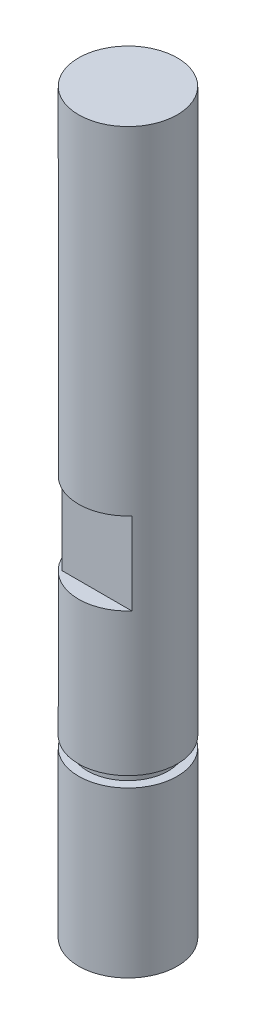
ISO-10303-21;
HEADER;
FILE_DESCRIPTION(('STEP AP214'),'2;1');
FILE_NAME('part.step','',(''),(''),'','','');
FILE_SCHEMA(('AUTOMOTIVE_DESIGN { 1 0 10303 214 1 1 1 1 }'));
ENDSEC;
DATA;
#1=APPLICATION_CONTEXT('core data for automotive mechanical design processes');
#2=APPLICATION_PROTOCOL_DEFINITION('international standard','automotive_design',2000,#1);
#3=PRODUCT_CONTEXT('',#1,'mechanical');
#4=PRODUCT('Part','Part','',(#3));
#5=PRODUCT_RELATED_PRODUCT_CATEGORY('part','',(#4));
#6=PRODUCT_DEFINITION_FORMATION('','',#4);
#7=PRODUCT_DEFINITION_CONTEXT('part definition',#1,'design');
#8=PRODUCT_DEFINITION('design','',#6,#7);
#9=PRODUCT_DEFINITION_SHAPE('','',#8);
#10=(LENGTH_UNIT() NAMED_UNIT(*) SI_UNIT(.MILLI.,.METRE.));
#11=(NAMED_UNIT(*) PLANE_ANGLE_UNIT() SI_UNIT($,.RADIAN.));
#12=(NAMED_UNIT(*) SI_UNIT($,.STERADIAN.) SOLID_ANGLE_UNIT());
#13=UNCERTAINTY_MEASURE_WITH_UNIT(LENGTH_MEASURE(1.E-05),#10,'distance_accuracy_value','');
#14=(GEOMETRIC_REPRESENTATION_CONTEXT(3) GLOBAL_UNCERTAINTY_ASSIGNED_CONTEXT((#13)) GLOBAL_UNIT_ASSIGNED_CONTEXT((#10,
#11,#12)) REPRESENTATION_CONTEXT('',''));
#15=CARTESIAN_POINT('',(0.,0.,0.));
#16=DIRECTION('',(0.,0.,1.));
#17=DIRECTION('',(1.,0.,0.));
#18=AXIS2_PLACEMENT_3D('',#15,#16,#17);
#19=CARTESIAN_POINT('',(0.,19.32,0.));
#20=DIRECTION('',(0.,1.,0.));
#21=DIRECTION('',(0.,0.,1.));
#22=AXIS2_PLACEMENT_3D('',#19,#20,#21);
#23=PLANE('',#22);
#24=CARTESIAN_POINT('',(0.,19.32,0.));
#25=DIRECTION('',(0.,1.,0.));
#26=DIRECTION('',(0.,0.,1.));
#27=AXIS2_PLACEMENT_3D('',#24,#25,#26);
#28=CIRCLE('',#27,3.);
#29=CARTESIAN_POINT('',(-2.,19.32,-2.23606797749979));
#30=VERTEX_POINT('',#29);
#31=CARTESIAN_POINT('',(2.23606797749979,19.32,2.));
#32=VERTEX_POINT('',#31);
#33=EDGE_CURVE('E59',#30,#32,#28,.T.);
#34=ORIENTED_EDGE('',*,*,#33,.T.);
#35=DIRECTION('',(-1.,0.,0.));
#36=VECTOR('',#35,1.);
#37=CARTESIAN_POINT('',(0.,19.32,2.));
#38=LINE('',#37,#36);
#39=CARTESIAN_POINT('',(-2.,19.32,2.));
#40=VERTEX_POINT('',#39);
#41=EDGE_CURVE('E94',#32,#40,#38,.T.);
#42=ORIENTED_EDGE('',*,*,#41,.T.);
#43=DIRECTION('',(0.,0.,1.));
#44=VECTOR('',#43,1.);
#45=CARTESIAN_POINT('',(-2.,19.32,0.));
#46=LINE('',#45,#44);
#47=EDGE_CURVE('E56',#30,#40,#46,.T.);
#48=ORIENTED_EDGE('',*,*,#47,.F.);
#49=EDGE_LOOP('',(#34,#42,#48));
#50=FACE_BOUND('',#49,.T.);
#51=ADVANCED_FACE('F38',(#50),#23,.T.);
#52=CARTESIAN_POINT('',(0.,10.,0.));
#53=DIRECTION('',(0.,1.,0.));
#54=DIRECTION('',(0.,0.,1.));
#55=AXIS2_PLACEMENT_3D('',#52,#53,#54);
#56=PLANE('',#55);
#57=CARTESIAN_POINT('',(0.,10.,0.));
#58=DIRECTION('',(0.,1.,0.));
#59=DIRECTION('',(0.,0.,1.));
#60=AXIS2_PLACEMENT_3D('',#57,#58,#59);
#61=CIRCLE('',#60,3.);
#62=CARTESIAN_POINT('',(0.,10.,3.));
#63=VERTEX_POINT('',#62);
#64=EDGE_CURVE('E11',#63,#63,#61,.T.);
#65=ORIENTED_EDGE('',*,*,#64,.T.);
#66=EDGE_LOOP('',(#65));
#67=FACE_BOUND('',#66,.T.);
#68=CARTESIAN_POINT('',(0.,10.,0.));
#69=DIRECTION('',(0.,1.,0.));
#70=DIRECTION('',(0.,0.,1.));
#71=AXIS2_PLACEMENT_3D('',#68,#69,#70);
#72=CIRCLE('',#71,2.45);
#73=CARTESIAN_POINT('',(0.,10.,2.45));
#74=VERTEX_POINT('',#73);
#75=EDGE_CURVE('E114',#74,#74,#72,.T.);
#76=ORIENTED_EDGE('',*,*,#75,.F.);
#77=EDGE_LOOP('',(#76));
#78=FACE_BOUND('',#77,.T.);
#79=ADVANCED_FACE('F137',(#67,#78),#56,.T.);
#80=CARTESIAN_POINT('',(0.,10.,0.));
#81=DIRECTION('',(0.,-1.,0.));
#82=DIRECTION('',(0.,0.,-1.));
#83=AXIS2_PLACEMENT_3D('',#80,#81,#82);
#84=CYLINDRICAL_SURFACE('',#83,3.);
#85=ORIENTED_EDGE('',*,*,#64,.F.);
#86=EDGE_LOOP('',(#85));
#87=FACE_BOUND('',#86,.T.);
#88=CARTESIAN_POINT('',(0.,0.,0.));
#89=DIRECTION('',(0.,1.,0.));
#90=DIRECTION('',(0.,0.,1.));
#91=AXIS2_PLACEMENT_3D('',#88,#89,#90);
#92=CIRCLE('',#91,3.);
#93=CARTESIAN_POINT('',(0.,0.,3.));
#94=VERTEX_POINT('',#93);
#95=EDGE_CURVE('E48',#94,#94,#92,.T.);
#96=ORIENTED_EDGE('',*,*,#95,.T.);
#97=EDGE_LOOP('',(#96));
#98=FACE_BOUND('',#97,.T.);
#99=ADVANCED_FACE('F40',(#87,#98),#84,.T.);
#100=CARTESIAN_POINT('',(0.,0.,0.));
#101=DIRECTION('',(0.,1.,0.));
#102=DIRECTION('',(0.,0.,1.));
#103=AXIS2_PLACEMENT_3D('',#100,#101,#102);
#104=PLANE('',#103);
#105=ORIENTED_EDGE('',*,*,#95,.F.);
#106=EDGE_LOOP('',(#105));
#107=FACE_BOUND('',#106,.T.);
#108=ADVANCED_FACE('F149',(#107),#104,.F.);
#109=CARTESIAN_POINT('',(0.,10.65,0.));
#110=DIRECTION('',(0.,-1.,0.));
#111=DIRECTION('',(0.,0.,-1.));
#112=AXIS2_PLACEMENT_3D('',#109,#110,#111);
#113=CYLINDRICAL_SURFACE('',#112,2.45);
#114=CARTESIAN_POINT('',(0.,10.65,0.));
#115=DIRECTION('',(0.,1.,0.));
#116=DIRECTION('',(0.,0.,1.));
#117=AXIS2_PLACEMENT_3D('',#114,#115,#116);
#118=CIRCLE('',#117,2.45);
#119=CARTESIAN_POINT('',(0.,10.65,2.45));
#120=VERTEX_POINT('',#119);
#121=EDGE_CURVE('E111',#120,#120,#118,.T.);
#122=ORIENTED_EDGE('',*,*,#121,.F.);
#123=EDGE_LOOP('',(#122));
#124=FACE_BOUND('',#123,.T.);
#125=ORIENTED_EDGE('',*,*,#75,.T.);
#126=EDGE_LOOP('',(#125));
#127=FACE_BOUND('',#126,.T.);
#128=ADVANCED_FACE('F145',(#124,#127),#113,.T.);
#129=CARTESIAN_POINT('',(0.,10.65,0.));
#130=DIRECTION('',(0.,1.,0.));
#131=DIRECTION('',(0.,0.,1.));
#132=AXIS2_PLACEMENT_3D('',#129,#130,#131);
#133=PLANE('',#132);
#134=CARTESIAN_POINT('',(0.,10.65,0.));
#135=DIRECTION('',(0.,1.,0.));
#136=DIRECTION('',(0.,0.,1.));
#137=AXIS2_PLACEMENT_3D('',#134,#135,#136);
#138=CIRCLE('',#137,3.);
#139=CARTESIAN_POINT('',(0.,10.65,3.));
#140=VERTEX_POINT('',#139);
#141=EDGE_CURVE('E108',#140,#140,#138,.T.);
#142=ORIENTED_EDGE('',*,*,#141,.F.);
#143=EDGE_LOOP('',(#142));
#144=FACE_BOUND('',#143,.T.);
#145=ORIENTED_EDGE('',*,*,#121,.T.);
#146=EDGE_LOOP('',(#145));
#147=FACE_BOUND('',#146,.T.);
#148=ADVANCED_FACE('F133',(#144,#147),#133,.F.);
#149=CARTESIAN_POINT('',(0.,19.32,0.));
#150=DIRECTION('',(0.,-1.,0.));
#151=DIRECTION('',(0.,0.,-1.));
#152=AXIS2_PLACEMENT_3D('',#149,#150,#151);
#153=CYLINDRICAL_SURFACE('',#152,3.);
#154=ORIENTED_EDGE('',*,*,#33,.F.);
#155=DIRECTION('',(0.,-1.,0.));
#156=VECTOR('',#155,1.);
#157=CARTESIAN_POINT('',(-2.,24.32,-2.23606797749979));
#158=LINE('',#157,#156);
#159=CARTESIAN_POINT('',(-2.,24.32,-2.23606797749979));
#160=VERTEX_POINT('',#159);
#161=EDGE_CURVE('E90',#160,#30,#158,.T.);
#162=ORIENTED_EDGE('',*,*,#161,.F.);
#163=CARTESIAN_POINT('',(0.,24.32,0.));
#164=DIRECTION('',(0.,1.,0.));
#165=DIRECTION('',(0.,0.,1.));
#166=AXIS2_PLACEMENT_3D('',#163,#164,#165);
#167=CIRCLE('',#166,3.);
#168=CARTESIAN_POINT('',(2.23606797749979,24.32,2.));
#169=VERTEX_POINT('',#168);
#170=EDGE_CURVE('E76',#160,#169,#167,.T.);
#171=ORIENTED_EDGE('',*,*,#170,.T.);
#172=DIRECTION('',(0.,-1.,0.));
#173=VECTOR('',#172,1.);
#174=CARTESIAN_POINT('',(2.23606797749979,24.32,2.));
#175=LINE('',#174,#173);
#176=EDGE_CURVE('E82',#169,#32,#175,.T.);
#177=ORIENTED_EDGE('',*,*,#176,.T.);
#178=EDGE_LOOP('',(#154,#162,#171,#177));
#179=FACE_BOUND('',#178,.T.);
#180=ORIENTED_EDGE('',*,*,#141,.T.);
#181=EDGE_LOOP('',(#180));
#182=FACE_BOUND('',#181,.T.);
#183=CARTESIAN_POINT('',(0.,44.82,0.));
#184=DIRECTION('',(0.,1.,0.));
#185=DIRECTION('',(0.,0.,1.));
#186=AXIS2_PLACEMENT_3D('',#183,#184,#185);
#187=CIRCLE('',#186,3.);
#188=CARTESIAN_POINT('',(0.,44.82,3.));
#189=VERTEX_POINT('',#188);
#190=EDGE_CURVE('E91',#189,#189,#187,.T.);
#191=ORIENTED_EDGE('',*,*,#190,.F.);
#192=EDGE_LOOP('',(#191));
#193=FACE_BOUND('',#192,.T.);
#194=ADVANCED_FACE('F86',(#179,#182,#193),#153,.T.);
#195=CARTESIAN_POINT('',(-2.,24.32,0.));
#196=DIRECTION('',(1.,0.,0.));
#197=DIRECTION('',(0.,0.,-1.));
#198=AXIS2_PLACEMENT_3D('',#195,#196,#197);
#199=PLANE('',#198);
#200=ORIENTED_EDGE('',*,*,#47,.T.);
#201=DIRECTION('',(0.,-1.,0.));
#202=VECTOR('',#201,1.);
#203=CARTESIAN_POINT('',(-2.,24.32,2.));
#204=LINE('',#203,#202);
#205=CARTESIAN_POINT('',(-2.,24.32,2.));
#206=VERTEX_POINT('',#205);
#207=EDGE_CURVE('E95',#206,#40,#204,.T.);
#208=ORIENTED_EDGE('',*,*,#207,.F.);
#209=DIRECTION('',(0.,0.,1.));
#210=VECTOR('',#209,1.);
#211=CARTESIAN_POINT('',(-2.,24.32,0.));
#212=LINE('',#211,#210);
#213=EDGE_CURVE('E42',#160,#206,#212,.T.);
#214=ORIENTED_EDGE('',*,*,#213,.F.);
#215=ORIENTED_EDGE('',*,*,#161,.T.);
#216=EDGE_LOOP('',(#200,#208,#214,#215));
#217=FACE_BOUND('',#216,.T.);
#218=ADVANCED_FACE('F125',(#217),#199,.F.);
#219=CARTESIAN_POINT('',(0.,24.32,2.));
#220=DIRECTION('',(0.,0.,1.));
#221=DIRECTION('',(1.,0.,0.));
#222=AXIS2_PLACEMENT_3D('',#219,#220,#221);
#223=PLANE('',#222);
#224=ORIENTED_EDGE('',*,*,#41,.F.);
#225=ORIENTED_EDGE('',*,*,#176,.F.);
#226=DIRECTION('',(-1.,0.,0.));
#227=VECTOR('',#226,1.);
#228=CARTESIAN_POINT('',(0.,24.32,2.));
#229=LINE('',#228,#227);
#230=EDGE_CURVE('E73',#169,#206,#229,.T.);
#231=ORIENTED_EDGE('',*,*,#230,.T.);
#232=ORIENTED_EDGE('',*,*,#207,.T.);
#233=EDGE_LOOP('',(#224,#225,#231,#232));
#234=FACE_BOUND('',#233,.T.);
#235=ADVANCED_FACE('F93',(#234),#223,.T.);
#236=CARTESIAN_POINT('',(0.,24.32,0.));
#237=DIRECTION('',(0.,1.,0.));
#238=DIRECTION('',(0.,0.,1.));
#239=AXIS2_PLACEMENT_3D('',#236,#237,#238);
#240=PLANE('',#239);
#241=ORIENTED_EDGE('',*,*,#170,.F.);
#242=ORIENTED_EDGE('',*,*,#213,.T.);
#243=ORIENTED_EDGE('',*,*,#230,.F.);
#244=EDGE_LOOP('',(#241,#242,#243));
#245=FACE_BOUND('',#244,.T.);
#246=ADVANCED_FACE('F75',(#245),#240,.F.);
#247=CARTESIAN_POINT('',(0.,44.82,0.));
#248=DIRECTION('',(0.,1.,0.));
#249=DIRECTION('',(0.,0.,1.));
#250=AXIS2_PLACEMENT_3D('',#247,#248,#249);
#251=PLANE('',#250);
#252=ORIENTED_EDGE('',*,*,#190,.T.);
#253=EDGE_LOOP('',(#252));
#254=FACE_BOUND('',#253,.T.);
#255=ADVANCED_FACE('F214',(#254),#251,.T.);
#256=CLOSED_SHELL('',(#51,#79,#99,#108,#128,#148,#194,#218,#235,#246,#255));
#257=MANIFOLD_SOLID_BREP('B2',#256);
#258=ADVANCED_BREP_SHAPE_REPRESENTATION('',(#18,#257),#14);
#259=SHAPE_DEFINITION_REPRESENTATION(#9,#258);
ENDSEC;
END-ISO-10303-21;
